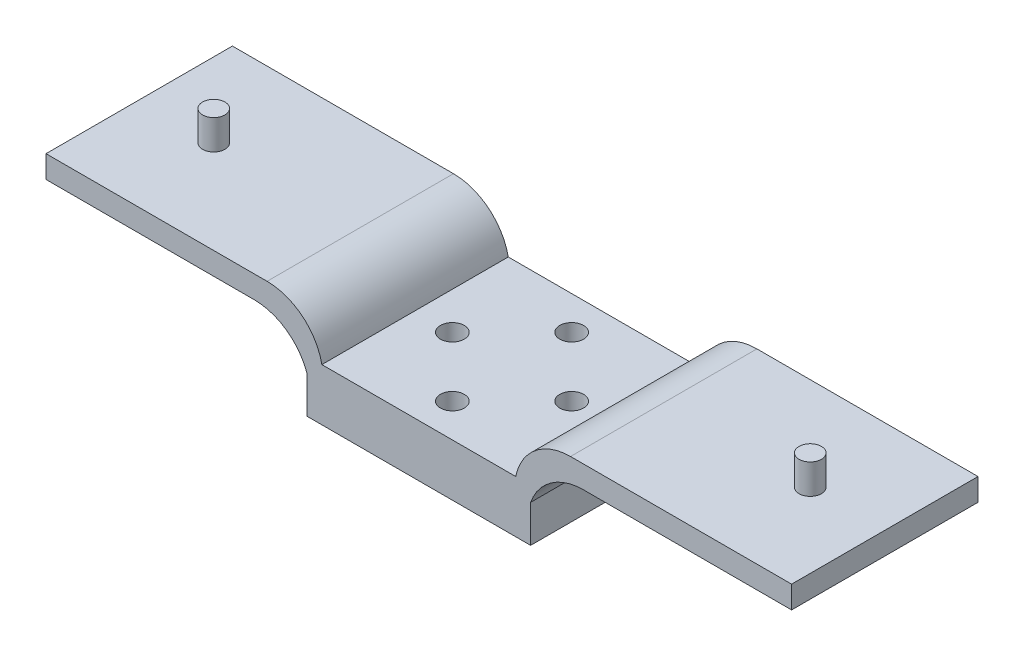
ISO-10303-21;
HEADER;
FILE_DESCRIPTION(('STEP AP214'),'2;1');
FILE_NAME('part.step','',(''),(''),'','','');
FILE_SCHEMA(('AUTOMOTIVE_DESIGN { 1 0 10303 214 1 1 1 1 }'));
ENDSEC;
DATA;
#1=APPLICATION_CONTEXT('core data for automotive mechanical design processes');
#2=APPLICATION_PROTOCOL_DEFINITION('international standard','automotive_design',2000,#1);
#3=PRODUCT_CONTEXT('',#1,'mechanical');
#4=PRODUCT('Part','Part','',(#3));
#5=PRODUCT_RELATED_PRODUCT_CATEGORY('part','',(#4));
#6=PRODUCT_DEFINITION_FORMATION('','',#4);
#7=PRODUCT_DEFINITION_CONTEXT('part definition',#1,'design');
#8=PRODUCT_DEFINITION('design','',#6,#7);
#9=PRODUCT_DEFINITION_SHAPE('','',#8);
#10=(LENGTH_UNIT() NAMED_UNIT(*) SI_UNIT(.MILLI.,.METRE.));
#11=(NAMED_UNIT(*) PLANE_ANGLE_UNIT() SI_UNIT($,.RADIAN.));
#12=(NAMED_UNIT(*) SI_UNIT($,.STERADIAN.) SOLID_ANGLE_UNIT());
#13=UNCERTAINTY_MEASURE_WITH_UNIT(LENGTH_MEASURE(1.E-05),#10,'distance_accuracy_value','');
#14=(GEOMETRIC_REPRESENTATION_CONTEXT(3) GLOBAL_UNCERTAINTY_ASSIGNED_CONTEXT((#13)) GLOBAL_UNIT_ASSIGNED_CONTEXT((#10,
#11,#12)) REPRESENTATION_CONTEXT('',''));
#15=CARTESIAN_POINT('',(0.,0.,0.));
#16=DIRECTION('',(0.,0.,1.));
#17=DIRECTION('',(1.,0.,0.));
#18=AXIS2_PLACEMENT_3D('',#15,#16,#17);
#19=CARTESIAN_POINT('',(0.,3.,0.));
#20=DIRECTION('',(0.,1.,0.));
#21=DIRECTION('',(0.,0.,1.));
#22=AXIS2_PLACEMENT_3D('',#19,#20,#21);
#23=PLANE('',#22);
#24=CARTESIAN_POINT('',(-40.,3.,0.));
#25=DIRECTION('',(0.,1.,0.));
#26=DIRECTION('',(0.,0.,1.));
#27=AXIS2_PLACEMENT_3D('',#24,#25,#26);
#28=CIRCLE('',#27,1.5);
#29=CARTESIAN_POINT('',(-40.,3.,1.5));
#30=VERTEX_POINT('',#29);
#31=EDGE_CURVE('E171',#30,#30,#28,.T.);
#32=ORIENTED_EDGE('',*,*,#31,.F.);
#33=EDGE_LOOP('',(#32));
#34=FACE_BOUND('',#33,.T.);
#35=DIRECTION('',(1.,0.,0.));
#36=VECTOR('',#35,1.);
#37=CARTESIAN_POINT('',(-50.,3.,12.5));
#38=LINE('',#37,#36);
#39=CARTESIAN_POINT('',(-50.,3.,12.5));
#40=VERTEX_POINT('',#39);
#41=CARTESIAN_POINT('',(-20.3484692283495,3.,12.5));
#42=VERTEX_POINT('',#41);
#43=EDGE_CURVE('E216',#40,#42,#38,.T.);
#44=ORIENTED_EDGE('',*,*,#43,.T.);
#45=DIRECTION('',(0.,0.,-1.));
#46=VECTOR('',#45,1.);
#47=CARTESIAN_POINT('',(-20.3484692283495,3.,-12.5));
#48=LINE('',#47,#46);
#49=CARTESIAN_POINT('',(-20.3484692283495,3.,-12.5));
#50=VERTEX_POINT('',#49);
#51=EDGE_CURVE('E241',#42,#50,#48,.T.);
#52=ORIENTED_EDGE('',*,*,#51,.T.);
#53=DIRECTION('',(-1.,0.,0.));
#54=VECTOR('',#53,1.);
#55=CARTESIAN_POINT('',(-50.,3.,-12.5));
#56=LINE('',#55,#54);
#57=CARTESIAN_POINT('',(-50.,3.,-12.5));
#58=VERTEX_POINT('',#57);
#59=EDGE_CURVE('E209',#50,#58,#56,.T.);
#60=ORIENTED_EDGE('',*,*,#59,.T.);
#61=DIRECTION('',(0.,0.,1.));
#62=VECTOR('',#61,1.);
#63=CARTESIAN_POINT('',(-50.,3.,-12.5));
#64=LINE('',#63,#62);
#65=EDGE_CURVE('E213',#58,#40,#64,.T.);
#66=ORIENTED_EDGE('',*,*,#65,.T.);
#67=EDGE_LOOP('',(#44,#52,#60,#66));
#68=FACE_BOUND('',#67,.T.);
#69=ADVANCED_FACE('F34',(#34,#68),#23,.T.);
#70=CARTESIAN_POINT('',(0.,0.,0.));
#71=DIRECTION('',(0.,1.,0.));
#72=DIRECTION('',(0.,0.,1.));
#73=AXIS2_PLACEMENT_3D('',#70,#71,#72);
#74=PLANE('',#73);
#75=DIRECTION('',(1.,0.,0.));
#76=VECTOR('',#75,1.);
#77=CARTESIAN_POINT('',(-50.,0.,12.5));
#78=LINE('',#77,#76);
#79=CARTESIAN_POINT('',(22.0710678118655,0.,12.5));
#80=VERTEX_POINT('',#79);
#81=CARTESIAN_POINT('',(50.,0.,12.5));
#82=VERTEX_POINT('',#81);
#83=EDGE_CURVE('E227',#80,#82,#78,.T.);
#84=ORIENTED_EDGE('',*,*,#83,.F.);
#85=DIRECTION('',(0.,0.,1.));
#86=VECTOR('',#85,1.);
#87=CARTESIAN_POINT('',(22.0710678118655,0.,0.));
#88=LINE('',#87,#86);
#89=CARTESIAN_POINT('',(22.0710678118655,0.,-12.5));
#90=VERTEX_POINT('',#89);
#91=EDGE_CURVE('E257',#80,#90,#88,.F.);
#92=ORIENTED_EDGE('',*,*,#91,.T.);
#93=DIRECTION('',(-1.,0.,0.));
#94=VECTOR('',#93,1.);
#95=CARTESIAN_POINT('',(-50.,0.,-12.5));
#96=LINE('',#95,#94);
#97=CARTESIAN_POINT('',(50.,0.,-12.5));
#98=VERTEX_POINT('',#97);
#99=EDGE_CURVE('E223',#98,#90,#96,.T.);
#100=ORIENTED_EDGE('',*,*,#99,.F.);
#101=DIRECTION('',(0.,0.,-1.));
#102=VECTOR('',#101,1.);
#103=CARTESIAN_POINT('',(50.,0.,-12.5));
#104=LINE('',#103,#102);
#105=EDGE_CURVE('E205',#82,#98,#104,.T.);
#106=ORIENTED_EDGE('',*,*,#105,.F.);
#107=EDGE_LOOP('',(#84,#92,#100,#106));
#108=FACE_BOUND('',#107,.T.);
#109=ADVANCED_FACE('F309',(#108),#74,.F.);
#110=CARTESIAN_POINT('',(-22.0710678118655,0.,-12.5));
#111=VERTEX_POINT('',#110);
#112=CARTESIAN_POINT('',(-50.,0.,-12.5));
#113=VERTEX_POINT('',#112);
#114=EDGE_CURVE('E222',#111,#113,#96,.T.);
#115=ORIENTED_EDGE('',*,*,#114,.F.);
#116=DIRECTION('',(0.,0.,-1.));
#117=VECTOR('',#116,1.);
#118=CARTESIAN_POINT('',(-22.0710678118655,0.,0.));
#119=LINE('',#118,#117);
#120=CARTESIAN_POINT('',(-22.0710678118655,0.,12.5));
#121=VERTEX_POINT('',#120);
#122=EDGE_CURVE('E255',#111,#121,#119,.F.);
#123=ORIENTED_EDGE('',*,*,#122,.T.);
#124=CARTESIAN_POINT('',(-50.,0.,12.5));
#125=VERTEX_POINT('',#124);
#126=EDGE_CURVE('E210',#125,#121,#78,.T.);
#127=ORIENTED_EDGE('',*,*,#126,.F.);
#128=DIRECTION('',(0.,0.,1.));
#129=VECTOR('',#128,1.);
#130=CARTESIAN_POINT('',(-50.,0.,-12.5));
#131=LINE('',#130,#129);
#132=EDGE_CURVE('E225',#113,#125,#131,.T.);
#133=ORIENTED_EDGE('',*,*,#132,.F.);
#134=EDGE_LOOP('',(#115,#123,#127,#133));
#135=FACE_BOUND('',#134,.T.);
#136=ADVANCED_FACE('F316',(#135),#74,.F.);
#137=CARTESIAN_POINT('',(50.,3.,-12.5));
#138=DIRECTION('',(-1.,0.,0.));
#139=DIRECTION('',(0.,0.,1.));
#140=AXIS2_PLACEMENT_3D('',#137,#138,#139);
#141=PLANE('',#140);
#142=ORIENTED_EDGE('',*,*,#105,.T.);
#143=DIRECTION('',(0.,-1.,0.));
#144=VECTOR('',#143,1.);
#145=CARTESIAN_POINT('',(50.,3.,-12.5));
#146=LINE('',#145,#144);
#147=CARTESIAN_POINT('',(50.,3.,-12.5));
#148=VERTEX_POINT('',#147);
#149=EDGE_CURVE('E238',#148,#98,#146,.T.);
#150=ORIENTED_EDGE('',*,*,#149,.F.);
#151=DIRECTION('',(0.,0.,-1.));
#152=VECTOR('',#151,1.);
#153=CARTESIAN_POINT('',(50.,3.,-12.5));
#154=LINE('',#153,#152);
#155=CARTESIAN_POINT('',(50.,3.,12.5));
#156=VERTEX_POINT('',#155);
#157=EDGE_CURVE('E206',#156,#148,#154,.T.);
#158=ORIENTED_EDGE('',*,*,#157,.F.);
#159=DIRECTION('',(0.,-1.,0.));
#160=VECTOR('',#159,1.);
#161=CARTESIAN_POINT('',(50.,3.,12.5));
#162=LINE('',#161,#160);
#163=EDGE_CURVE('E219',#156,#82,#162,.T.);
#164=ORIENTED_EDGE('',*,*,#163,.T.);
#165=EDGE_LOOP('',(#142,#150,#158,#164));
#166=FACE_BOUND('',#165,.T.);
#167=ADVANCED_FACE('F360',(#166),#141,.F.);
#168=CARTESIAN_POINT('',(-50.,3.,-12.5));
#169=DIRECTION('',(0.,0.,1.));
#170=DIRECTION('',(1.,0.,0.));
#171=AXIS2_PLACEMENT_3D('',#168,#169,#170);
#172=PLANE('',#171);
#173=ORIENTED_EDGE('',*,*,#59,.F.);
#174=CARTESIAN_POINT('',(-20.3484692283495,-4.5,-12.5));
#175=DIRECTION('',(0.,0.,1.));
#176=DIRECTION('',(1.,0.,0.));
#177=AXIS2_PLACEMENT_3D('',#174,#175,#176);
#178=CIRCLE('',#177,7.5);
#179=CARTESIAN_POINT('',(-13.,-3.,-12.5));
#180=VERTEX_POINT('',#179);
#181=EDGE_CURVE('E248',#50,#180,#178,.F.);
#182=ORIENTED_EDGE('',*,*,#181,.T.);
#183=DIRECTION('',(-1.,0.,0.));
#184=VECTOR('',#183,1.);
#185=CARTESIAN_POINT('',(13.,-3.,-12.5));
#186=LINE('',#185,#184);
#187=CARTESIAN_POINT('',(13.,-3.,-12.5));
#188=VERTEX_POINT('',#187);
#189=EDGE_CURVE('E176',#188,#180,#186,.T.);
#190=ORIENTED_EDGE('',*,*,#189,.F.);
#191=CARTESIAN_POINT('',(20.3484692283495,-4.5,-12.5));
#192=DIRECTION('',(0.,0.,1.));
#193=DIRECTION('',(1.,0.,0.));
#194=AXIS2_PLACEMENT_3D('',#191,#192,#193);
#195=CIRCLE('',#194,7.5);
#196=CARTESIAN_POINT('',(20.3484692283495,3.,-12.5));
#197=VERTEX_POINT('',#196);
#198=EDGE_CURVE('E246',#188,#197,#195,.F.);
#199=ORIENTED_EDGE('',*,*,#198,.T.);
#200=EDGE_CURVE('E211',#148,#197,#56,.T.);
#201=ORIENTED_EDGE('',*,*,#200,.F.);
#202=ORIENTED_EDGE('',*,*,#149,.T.);
#203=ORIENTED_EDGE('',*,*,#99,.T.);
#204=CARTESIAN_POINT('',(22.0710678118655,-7.5,-12.5));
#205=DIRECTION('',(0.,0.,1.));
#206=DIRECTION('',(1.,0.,0.));
#207=AXIS2_PLACEMENT_3D('',#204,#205,#206);
#208=CIRCLE('',#207,7.5);
#209=CARTESIAN_POINT('',(15.,-5.,-12.5));
#210=VERTEX_POINT('',#209);
#211=EDGE_CURVE('E11',#90,#210,#208,.T.);
#212=ORIENTED_EDGE('',*,*,#211,.T.);
#213=DIRECTION('',(0.,1.,0.));
#214=VECTOR('',#213,1.);
#215=CARTESIAN_POINT('',(15.,-10.,-12.5));
#216=LINE('',#215,#214);
#217=CARTESIAN_POINT('',(15.,-10.,-12.5));
#218=VERTEX_POINT('',#217);
#219=EDGE_CURVE('E140',#218,#210,#216,.T.);
#220=ORIENTED_EDGE('',*,*,#219,.F.);
#221=DIRECTION('',(1.,0.,0.));
#222=VECTOR('',#221,1.);
#223=CARTESIAN_POINT('',(-15.,-10.,-12.5));
#224=LINE('',#223,#222);
#225=CARTESIAN_POINT('',(-15.,-10.,-12.5));
#226=VERTEX_POINT('',#225);
#227=EDGE_CURVE('E145',#226,#218,#224,.T.);
#228=ORIENTED_EDGE('',*,*,#227,.F.);
#229=DIRECTION('',(0.,1.,0.));
#230=VECTOR('',#229,1.);
#231=CARTESIAN_POINT('',(-15.,-10.,-12.5));
#232=LINE('',#231,#230);
#233=CARTESIAN_POINT('',(-15.,-5.,-12.5));
#234=VERTEX_POINT('',#233);
#235=EDGE_CURVE('E273',#226,#234,#232,.T.);
#236=ORIENTED_EDGE('',*,*,#235,.T.);
#237=CARTESIAN_POINT('',(-22.0710678118655,-7.5,-12.5));
#238=DIRECTION('',(0.,0.,1.));
#239=DIRECTION('',(1.,0.,0.));
#240=AXIS2_PLACEMENT_3D('',#237,#238,#239);
#241=CIRCLE('',#240,7.5);
#242=EDGE_CURVE('E259',#234,#111,#241,.T.);
#243=ORIENTED_EDGE('',*,*,#242,.T.);
#244=ORIENTED_EDGE('',*,*,#114,.T.);
#245=DIRECTION('',(0.,-1.,0.));
#246=VECTOR('',#245,1.);
#247=CARTESIAN_POINT('',(-50.,3.,-12.5));
#248=LINE('',#247,#246);
#249=EDGE_CURVE('E235',#58,#113,#248,.T.);
#250=ORIENTED_EDGE('',*,*,#249,.F.);
#251=EDGE_LOOP('',(#173,#182,#190,#199,#201,#202,#203,#212,#220,#228,#236,#243,#244,#250));
#252=FACE_BOUND('',#251,.T.);
#253=ADVANCED_FACE('F158',(#252),#172,.F.);
#254=CARTESIAN_POINT('',(-50.,3.,-12.5));
#255=DIRECTION('',(1.,0.,0.));
#256=DIRECTION('',(0.,0.,-1.));
#257=AXIS2_PLACEMENT_3D('',#254,#255,#256);
#258=PLANE('',#257);
#259=ORIENTED_EDGE('',*,*,#132,.T.);
#260=DIRECTION('',(0.,-1.,0.));
#261=VECTOR('',#260,1.);
#262=CARTESIAN_POINT('',(-50.,3.,12.5));
#263=LINE('',#262,#261);
#264=EDGE_CURVE('E232',#40,#125,#263,.T.);
#265=ORIENTED_EDGE('',*,*,#264,.F.);
#266=ORIENTED_EDGE('',*,*,#65,.F.);
#267=ORIENTED_EDGE('',*,*,#249,.T.);
#268=EDGE_LOOP('',(#259,#265,#266,#267));
#269=FACE_BOUND('',#268,.T.);
#270=ADVANCED_FACE('F332',(#269),#258,.F.);
#271=CARTESIAN_POINT('',(-50.,3.,12.5));
#272=DIRECTION('',(0.,0.,-1.));
#273=DIRECTION('',(-1.,0.,0.));
#274=AXIS2_PLACEMENT_3D('',#271,#272,#273);
#275=PLANE('',#274);
#276=DIRECTION('',(-1.,0.,0.));
#277=VECTOR('',#276,1.);
#278=CARTESIAN_POINT('',(13.,-3.,12.5));
#279=LINE('',#278,#277);
#280=CARTESIAN_POINT('',(13.,-3.,12.5));
#281=VERTEX_POINT('',#280);
#282=CARTESIAN_POINT('',(-13.,-3.,12.5));
#283=VERTEX_POINT('',#282);
#284=EDGE_CURVE('E179',#281,#283,#279,.T.);
#285=ORIENTED_EDGE('',*,*,#284,.T.);
#286=CARTESIAN_POINT('',(-20.3484692283495,-4.5,12.5));
#287=DIRECTION('',(0.,0.,-1.));
#288=DIRECTION('',(-1.,0.,0.));
#289=AXIS2_PLACEMENT_3D('',#286,#287,#288);
#290=CIRCLE('',#289,7.5);
#291=EDGE_CURVE('E252',#283,#42,#290,.F.);
#292=ORIENTED_EDGE('',*,*,#291,.T.);
#293=ORIENTED_EDGE('',*,*,#43,.F.);
#294=ORIENTED_EDGE('',*,*,#264,.T.);
#295=ORIENTED_EDGE('',*,*,#126,.T.);
#296=CARTESIAN_POINT('',(-22.0710678118655,-7.5,12.5));
#297=DIRECTION('',(0.,0.,-1.));
#298=DIRECTION('',(-1.,0.,0.));
#299=AXIS2_PLACEMENT_3D('',#296,#297,#298);
#300=CIRCLE('',#299,7.5);
#301=CARTESIAN_POINT('',(-15.,-5.,12.5));
#302=VERTEX_POINT('',#301);
#303=EDGE_CURVE('E261',#121,#302,#300,.T.);
#304=ORIENTED_EDGE('',*,*,#303,.T.);
#305=DIRECTION('',(0.,1.,0.));
#306=VECTOR('',#305,1.);
#307=CARTESIAN_POINT('',(-15.,-10.,12.5));
#308=LINE('',#307,#306);
#309=CARTESIAN_POINT('',(-15.,-10.,12.5));
#310=VERTEX_POINT('',#309);
#311=EDGE_CURVE('E166',#310,#302,#308,.T.);
#312=ORIENTED_EDGE('',*,*,#311,.F.);
#313=DIRECTION('',(-1.,0.,0.));
#314=VECTOR('',#313,1.);
#315=CARTESIAN_POINT('',(15.,-10.,12.5));
#316=LINE('',#315,#314);
#317=CARTESIAN_POINT('',(15.,-10.,12.5));
#318=VERTEX_POINT('',#317);
#319=EDGE_CURVE('E144',#318,#310,#316,.T.);
#320=ORIENTED_EDGE('',*,*,#319,.F.);
#321=DIRECTION('',(0.,1.,0.));
#322=VECTOR('',#321,1.);
#323=CARTESIAN_POINT('',(15.,-10.,12.5));
#324=LINE('',#323,#322);
#325=CARTESIAN_POINT('',(15.,-5.,12.5));
#326=VERTEX_POINT('',#325);
#327=EDGE_CURVE('E141',#318,#326,#324,.T.);
#328=ORIENTED_EDGE('',*,*,#327,.T.);
#329=CARTESIAN_POINT('',(22.0710678118655,-7.5,12.5));
#330=DIRECTION('',(0.,0.,-1.));
#331=DIRECTION('',(-1.,0.,0.));
#332=AXIS2_PLACEMENT_3D('',#329,#330,#331);
#333=CIRCLE('',#332,7.5);
#334=EDGE_CURVE('E42',#326,#80,#333,.T.);
#335=ORIENTED_EDGE('',*,*,#334,.T.);
#336=ORIENTED_EDGE('',*,*,#83,.T.);
#337=ORIENTED_EDGE('',*,*,#163,.F.);
#338=CARTESIAN_POINT('',(20.3484692283495,3.,12.5));
#339=VERTEX_POINT('',#338);
#340=EDGE_CURVE('E215',#339,#156,#38,.T.);
#341=ORIENTED_EDGE('',*,*,#340,.F.);
#342=CARTESIAN_POINT('',(20.3484692283495,-4.5,12.5));
#343=DIRECTION('',(0.,0.,-1.));
#344=DIRECTION('',(-1.,0.,0.));
#345=AXIS2_PLACEMENT_3D('',#342,#343,#344);
#346=CIRCLE('',#345,7.5);
#347=EDGE_CURVE('E250',#339,#281,#346,.F.);
#348=ORIENTED_EDGE('',*,*,#347,.T.);
#349=EDGE_LOOP('',(#285,#292,#293,#294,#295,#304,#312,#320,#328,#335,#336,#337,#341,#348));
#350=FACE_BOUND('',#349,.T.);
#351=ADVANCED_FACE('F265',(#350),#275,.F.);
#352=CARTESIAN_POINT('',(40.,3.,0.));
#353=DIRECTION('',(0.,1.,0.));
#354=DIRECTION('',(0.,0.,1.));
#355=AXIS2_PLACEMENT_3D('',#352,#353,#354);
#356=CIRCLE('',#355,1.5);
#357=CARTESIAN_POINT('',(40.,3.,1.49999999999999));
#358=VERTEX_POINT('',#357);
#359=EDGE_CURVE('E161',#358,#358,#356,.T.);
#360=ORIENTED_EDGE('',*,*,#359,.F.);
#361=EDGE_LOOP('',(#360));
#362=FACE_BOUND('',#361,.T.);
#363=ORIENTED_EDGE('',*,*,#200,.T.);
#364=DIRECTION('',(0.,0.,1.));
#365=VECTOR('',#364,1.);
#366=CARTESIAN_POINT('',(20.3484692283495,3.,12.5));
#367=LINE('',#366,#365);
#368=EDGE_CURVE('E49',#197,#339,#367,.T.);
#369=ORIENTED_EDGE('',*,*,#368,.T.);
#370=ORIENTED_EDGE('',*,*,#340,.T.);
#371=ORIENTED_EDGE('',*,*,#157,.T.);
#372=EDGE_LOOP('',(#363,#369,#370,#371));
#373=FACE_BOUND('',#372,.T.);
#374=ADVANCED_FACE('F312',(#362,#373),#23,.T.);
#375=CARTESIAN_POINT('',(0.,3.,8.));
#376=DIRECTION('',(0.,-1.,0.));
#377=DIRECTION('',(0.,0.,-1.));
#378=AXIS2_PLACEMENT_3D('',#375,#376,#377);
#379=CYLINDRICAL_SURFACE('',#378,1.6);
#380=CARTESIAN_POINT('',(0.,-3.,8.));
#381=DIRECTION('',(0.,-1.,0.));
#382=DIRECTION('',(0.,0.,-1.));
#383=AXIS2_PLACEMENT_3D('',#380,#381,#382);
#384=CIRCLE('',#383,1.6);
#385=CARTESIAN_POINT('',(0.,-3.,6.4));
#386=VERTEX_POINT('',#385);
#387=EDGE_CURVE('E197',#386,#386,#384,.F.);
#388=ORIENTED_EDGE('',*,*,#387,.T.);
#389=EDGE_LOOP('',(#388));
#390=FACE_BOUND('',#389,.T.);
#391=CARTESIAN_POINT('',(0.,-10.,8.));
#392=DIRECTION('',(0.,-1.,0.));
#393=DIRECTION('',(0.,0.,-1.));
#394=AXIS2_PLACEMENT_3D('',#391,#392,#393);
#395=CIRCLE('',#394,1.6);
#396=CARTESIAN_POINT('',(0.,-10.,6.4));
#397=VERTEX_POINT('',#396);
#398=EDGE_CURVE('E286',#397,#397,#395,.T.);
#399=ORIENTED_EDGE('',*,*,#398,.T.);
#400=EDGE_LOOP('',(#399));
#401=FACE_BOUND('',#400,.T.);
#402=ADVANCED_FACE('F290',(#390,#401),#379,.F.);
#403=CARTESIAN_POINT('',(-8.,3.,0.));
#404=DIRECTION('',(0.,-1.,0.));
#405=DIRECTION('',(0.,0.,-1.));
#406=AXIS2_PLACEMENT_3D('',#403,#404,#405);
#407=CYLINDRICAL_SURFACE('',#406,1.6);
#408=CARTESIAN_POINT('',(-8.,-3.,0.));
#409=DIRECTION('',(0.,-1.,0.));
#410=DIRECTION('',(0.,0.,-1.));
#411=AXIS2_PLACEMENT_3D('',#408,#409,#410);
#412=CIRCLE('',#411,1.6);
#413=CARTESIAN_POINT('',(-8.,-3.,-1.59999999999995));
#414=VERTEX_POINT('',#413);
#415=EDGE_CURVE('E194',#414,#414,#412,.F.);
#416=ORIENTED_EDGE('',*,*,#415,.T.);
#417=EDGE_LOOP('',(#416));
#418=FACE_BOUND('',#417,.T.);
#419=CARTESIAN_POINT('',(-8.,-10.,0.));
#420=DIRECTION('',(0.,-1.,0.));
#421=DIRECTION('',(0.,0.,-1.));
#422=AXIS2_PLACEMENT_3D('',#419,#420,#421);
#423=CIRCLE('',#422,1.6);
#424=CARTESIAN_POINT('',(-8.,-10.,-1.59999999999995));
#425=VERTEX_POINT('',#424);
#426=EDGE_CURVE('E280',#425,#425,#423,.T.);
#427=ORIENTED_EDGE('',*,*,#426,.T.);
#428=EDGE_LOOP('',(#427));
#429=FACE_BOUND('',#428,.T.);
#430=ADVANCED_FACE('F329',(#418,#429),#407,.F.);
#431=CARTESIAN_POINT('',(0.,3.,-8.));
#432=DIRECTION('',(0.,-1.,0.));
#433=DIRECTION('',(0.,0.,-1.));
#434=AXIS2_PLACEMENT_3D('',#431,#432,#433);
#435=CYLINDRICAL_SURFACE('',#434,1.6);
#436=CARTESIAN_POINT('',(0.,-3.,-8.));
#437=DIRECTION('',(0.,-1.,0.));
#438=DIRECTION('',(0.,0.,-1.));
#439=AXIS2_PLACEMENT_3D('',#436,#437,#438);
#440=CIRCLE('',#439,1.6);
#441=CARTESIAN_POINT('',(0.,-3.,-9.6));
#442=VERTEX_POINT('',#441);
#443=EDGE_CURVE('E191',#442,#442,#440,.F.);
#444=ORIENTED_EDGE('',*,*,#443,.T.);
#445=EDGE_LOOP('',(#444));
#446=FACE_BOUND('',#445,.T.);
#447=CARTESIAN_POINT('',(0.,-10.,-8.));
#448=DIRECTION('',(0.,-1.,0.));
#449=DIRECTION('',(0.,0.,-1.));
#450=AXIS2_PLACEMENT_3D('',#447,#448,#449);
#451=CIRCLE('',#450,1.6);
#452=CARTESIAN_POINT('',(0.,-10.,-9.6));
#453=VERTEX_POINT('',#452);
#454=EDGE_CURVE('E155',#453,#453,#451,.T.);
#455=ORIENTED_EDGE('',*,*,#454,.T.);
#456=EDGE_LOOP('',(#455));
#457=FACE_BOUND('',#456,.T.);
#458=ADVANCED_FACE('F401',(#446,#457),#435,.F.);
#459=CARTESIAN_POINT('',(8.,3.,0.));
#460=DIRECTION('',(0.,-1.,0.));
#461=DIRECTION('',(0.,0.,-1.));
#462=AXIS2_PLACEMENT_3D('',#459,#460,#461);
#463=CYLINDRICAL_SURFACE('',#462,1.6);
#464=CARTESIAN_POINT('',(8.,-3.,0.));
#465=DIRECTION('',(0.,-1.,0.));
#466=DIRECTION('',(0.,0.,-1.));
#467=AXIS2_PLACEMENT_3D('',#464,#465,#466);
#468=CIRCLE('',#467,1.6);
#469=CARTESIAN_POINT('',(8.,-3.,-1.6));
#470=VERTEX_POINT('',#469);
#471=EDGE_CURVE('E188',#470,#470,#468,.F.);
#472=ORIENTED_EDGE('',*,*,#471,.T.);
#473=EDGE_LOOP('',(#472));
#474=FACE_BOUND('',#473,.T.);
#475=CARTESIAN_POINT('',(8.,-10.,0.));
#476=DIRECTION('',(0.,-1.,0.));
#477=DIRECTION('',(0.,0.,-1.));
#478=AXIS2_PLACEMENT_3D('',#475,#476,#477);
#479=CIRCLE('',#478,1.6);
#480=CARTESIAN_POINT('',(8.,-10.,-1.6));
#481=VERTEX_POINT('',#480);
#482=EDGE_CURVE('E283',#481,#481,#479,.T.);
#483=ORIENTED_EDGE('',*,*,#482,.T.);
#484=EDGE_LOOP('',(#483));
#485=FACE_BOUND('',#484,.T.);
#486=ADVANCED_FACE('F398',(#474,#485),#463,.F.);
#487=CARTESIAN_POINT('',(13.,-3.,12.5));
#488=DIRECTION('',(0.,-1.,0.));
#489=DIRECTION('',(0.,0.,-1.));
#490=AXIS2_PLACEMENT_3D('',#487,#488,#489);
#491=PLANE('',#490);
#492=ORIENTED_EDGE('',*,*,#415,.F.);
#493=EDGE_LOOP('',(#492));
#494=FACE_BOUND('',#493,.T.);
#495=ORIENTED_EDGE('',*,*,#471,.F.);
#496=EDGE_LOOP('',(#495));
#497=FACE_BOUND('',#496,.T.);
#498=ORIENTED_EDGE('',*,*,#189,.T.);
#499=DIRECTION('',(0.,0.,-1.));
#500=VECTOR('',#499,1.);
#501=CARTESIAN_POINT('',(-13.,-3.,12.5));
#502=LINE('',#501,#500);
#503=EDGE_CURVE('E185',#283,#180,#502,.T.);
#504=ORIENTED_EDGE('',*,*,#503,.F.);
#505=ORIENTED_EDGE('',*,*,#284,.F.);
#506=DIRECTION('',(0.,0.,-1.));
#507=VECTOR('',#506,1.);
#508=CARTESIAN_POINT('',(13.,-3.,12.5));
#509=LINE('',#508,#507);
#510=EDGE_CURVE('E182',#281,#188,#509,.T.);
#511=ORIENTED_EDGE('',*,*,#510,.T.);
#512=EDGE_LOOP('',(#498,#504,#505,#511));
#513=FACE_BOUND('',#512,.T.);
#514=ORIENTED_EDGE('',*,*,#443,.F.);
#515=EDGE_LOOP('',(#514));
#516=FACE_BOUND('',#515,.T.);
#517=ORIENTED_EDGE('',*,*,#387,.F.);
#518=EDGE_LOOP('',(#517));
#519=FACE_BOUND('',#518,.T.);
#520=ADVANCED_FACE('F345',(#494,#497,#513,#516,#519),#491,.F.);
#521=CARTESIAN_POINT('',(-20.3484692283495,-4.5,12.5));
#522=DIRECTION('',(0.,0.,1.));
#523=DIRECTION('',(1.,0.,0.));
#524=AXIS2_PLACEMENT_3D('',#521,#522,#523);
#525=CYLINDRICAL_SURFACE('',#524,7.5);
#526=ORIENTED_EDGE('',*,*,#291,.F.);
#527=ORIENTED_EDGE('',*,*,#503,.T.);
#528=ORIENTED_EDGE('',*,*,#181,.F.);
#529=ORIENTED_EDGE('',*,*,#51,.F.);
#530=EDGE_LOOP('',(#526,#527,#528,#529));
#531=FACE_BOUND('',#530,.T.);
#532=ADVANCED_FACE('F349',(#531),#525,.T.);
#533=CARTESIAN_POINT('',(20.3484692283495,-4.5,12.5));
#534=DIRECTION('',(0.,0.,-1.));
#535=DIRECTION('',(-1.,0.,0.));
#536=AXIS2_PLACEMENT_3D('',#533,#534,#535);
#537=CYLINDRICAL_SURFACE('',#536,7.5);
#538=ORIENTED_EDGE('',*,*,#347,.F.);
#539=ORIENTED_EDGE('',*,*,#368,.F.);
#540=ORIENTED_EDGE('',*,*,#198,.F.);
#541=ORIENTED_EDGE('',*,*,#510,.F.);
#542=EDGE_LOOP('',(#538,#539,#540,#541));
#543=FACE_BOUND('',#542,.T.);
#544=ADVANCED_FACE('F339',(#543),#537,.T.);
#545=CARTESIAN_POINT('',(-22.0710678118655,-7.5,12.5));
#546=DIRECTION('',(0.,0.,-1.));
#547=DIRECTION('',(-1.,0.,0.));
#548=AXIS2_PLACEMENT_3D('',#545,#546,#547);
#549=CYLINDRICAL_SURFACE('',#548,7.5);
#550=ORIENTED_EDGE('',*,*,#303,.F.);
#551=ORIENTED_EDGE('',*,*,#122,.F.);
#552=ORIENTED_EDGE('',*,*,#242,.F.);
#553=DIRECTION('',(0.,0.,-1.));
#554=VECTOR('',#553,1.);
#555=CARTESIAN_POINT('',(-15.,-5.,12.5));
#556=LINE('',#555,#554);
#557=EDGE_CURVE('E202',#302,#234,#556,.T.);
#558=ORIENTED_EDGE('',*,*,#557,.F.);
#559=EDGE_LOOP('',(#550,#551,#552,#558));
#560=FACE_BOUND('',#559,.T.);
#561=ADVANCED_FACE('F270',(#560),#549,.F.);
#562=CARTESIAN_POINT('',(22.0710678118655,-7.5,12.5));
#563=DIRECTION('',(0.,0.,1.));
#564=DIRECTION('',(1.,0.,0.));
#565=AXIS2_PLACEMENT_3D('',#562,#563,#564);
#566=CYLINDRICAL_SURFACE('',#565,7.5);
#567=ORIENTED_EDGE('',*,*,#211,.F.);
#568=ORIENTED_EDGE('',*,*,#91,.F.);
#569=ORIENTED_EDGE('',*,*,#334,.F.);
#570=DIRECTION('',(0.,0.,1.));
#571=VECTOR('',#570,1.);
#572=CARTESIAN_POINT('',(15.,-5.,12.5));
#573=LINE('',#572,#571);
#574=EDGE_CURVE('E200',#210,#326,#573,.T.);
#575=ORIENTED_EDGE('',*,*,#574,.F.);
#576=EDGE_LOOP('',(#567,#568,#569,#575));
#577=FACE_BOUND('',#576,.T.);
#578=ADVANCED_FACE('F36',(#577),#566,.F.);
#579=CARTESIAN_POINT('',(-40.,7.,0.));
#580=DIRECTION('',(0.,-1.,0.));
#581=DIRECTION('',(0.,0.,-1.));
#582=AXIS2_PLACEMENT_3D('',#579,#580,#581);
#583=CYLINDRICAL_SURFACE('',#582,1.5);
#584=CARTESIAN_POINT('',(-40.,7.,0.));
#585=DIRECTION('',(0.,1.,0.));
#586=DIRECTION('',(0.,0.,1.));
#587=AXIS2_PLACEMENT_3D('',#584,#585,#586);
#588=CIRCLE('',#587,1.5);
#589=CARTESIAN_POINT('',(-40.,7.,1.5));
#590=VERTEX_POINT('',#589);
#591=EDGE_CURVE('E173',#590,#590,#588,.T.);
#592=ORIENTED_EDGE('',*,*,#591,.F.);
#593=EDGE_LOOP('',(#592));
#594=FACE_BOUND('',#593,.T.);
#595=ORIENTED_EDGE('',*,*,#31,.T.);
#596=EDGE_LOOP('',(#595));
#597=FACE_BOUND('',#596,.T.);
#598=ADVANCED_FACE('F378',(#594,#597),#583,.T.);
#599=CARTESIAN_POINT('',(-40.,7.,0.));
#600=DIRECTION('',(0.,1.,0.));
#601=DIRECTION('',(0.,0.,1.));
#602=AXIS2_PLACEMENT_3D('',#599,#600,#601);
#603=PLANE('',#602);
#604=ORIENTED_EDGE('',*,*,#591,.T.);
#605=EDGE_LOOP('',(#604));
#606=FACE_BOUND('',#605,.T.);
#607=ADVANCED_FACE('F383',(#606),#603,.T.);
#608=CARTESIAN_POINT('',(40.,7.,0.));
#609=DIRECTION('',(0.,-1.,0.));
#610=DIRECTION('',(0.,0.,-1.));
#611=AXIS2_PLACEMENT_3D('',#608,#609,#610);
#612=CYLINDRICAL_SURFACE('',#611,1.5);
#613=CARTESIAN_POINT('',(40.,7.,0.));
#614=DIRECTION('',(0.,1.,0.));
#615=DIRECTION('',(0.,0.,1.));
#616=AXIS2_PLACEMENT_3D('',#613,#614,#615);
#617=CIRCLE('',#616,1.5);
#618=CARTESIAN_POINT('',(40.,7.,1.49999999999999));
#619=VERTEX_POINT('',#618);
#620=EDGE_CURVE('E164',#619,#619,#617,.T.);
#621=ORIENTED_EDGE('',*,*,#620,.F.);
#622=EDGE_LOOP('',(#621));
#623=FACE_BOUND('',#622,.T.);
#624=ORIENTED_EDGE('',*,*,#359,.T.);
#625=EDGE_LOOP('',(#624));
#626=FACE_BOUND('',#625,.T.);
#627=ADVANCED_FACE('F302',(#623,#626),#612,.T.);
#628=CARTESIAN_POINT('',(40.,7.,0.));
#629=DIRECTION('',(0.,1.,0.));
#630=DIRECTION('',(0.,0.,1.));
#631=AXIS2_PLACEMENT_3D('',#628,#629,#630);
#632=PLANE('',#631);
#633=ORIENTED_EDGE('',*,*,#620,.T.);
#634=EDGE_LOOP('',(#633));
#635=FACE_BOUND('',#634,.T.);
#636=ADVANCED_FACE('F293',(#635),#632,.T.);
#637=CARTESIAN_POINT('',(0.,-10.,0.));
#638=DIRECTION('',(0.,-1.,0.));
#639=DIRECTION('',(0.,0.,-1.));
#640=AXIS2_PLACEMENT_3D('',#637,#638,#639);
#641=PLANE('',#640);
#642=ORIENTED_EDGE('',*,*,#482,.F.);
#643=EDGE_LOOP('',(#642));
#644=FACE_BOUND('',#643,.T.);
#645=ORIENTED_EDGE('',*,*,#454,.F.);
#646=EDGE_LOOP('',(#645));
#647=FACE_BOUND('',#646,.T.);
#648=ORIENTED_EDGE('',*,*,#227,.T.);
#649=DIRECTION('',(0.,0.,1.));
#650=VECTOR('',#649,1.);
#651=CARTESIAN_POINT('',(15.,-10.,-12.5));
#652=LINE('',#651,#650);
#653=EDGE_CURVE('E135',#218,#318,#652,.T.);
#654=ORIENTED_EDGE('',*,*,#653,.T.);
#655=ORIENTED_EDGE('',*,*,#319,.T.);
#656=DIRECTION('',(0.,0.,-1.));
#657=VECTOR('',#656,1.);
#658=CARTESIAN_POINT('',(-15.,-10.,12.5));
#659=LINE('',#658,#657);
#660=EDGE_CURVE('E151',#310,#226,#659,.T.);
#661=ORIENTED_EDGE('',*,*,#660,.T.);
#662=EDGE_LOOP('',(#648,#654,#655,#661));
#663=FACE_BOUND('',#662,.T.);
#664=ORIENTED_EDGE('',*,*,#426,.F.);
#665=EDGE_LOOP('',(#664));
#666=FACE_BOUND('',#665,.T.);
#667=ORIENTED_EDGE('',*,*,#398,.F.);
#668=EDGE_LOOP('',(#667));
#669=FACE_BOUND('',#668,.T.);
#670=ADVANCED_FACE('F148',(#644,#647,#663,#666,#669),#641,.T.);
#671=CARTESIAN_POINT('',(15.,-10.,-12.5));
#672=DIRECTION('',(-1.,0.,0.));
#673=DIRECTION('',(0.,0.,1.));
#674=AXIS2_PLACEMENT_3D('',#671,#672,#673);
#675=PLANE('',#674);
#676=ORIENTED_EDGE('',*,*,#574,.T.);
#677=ORIENTED_EDGE('',*,*,#327,.F.);
#678=ORIENTED_EDGE('',*,*,#653,.F.);
#679=ORIENTED_EDGE('',*,*,#219,.T.);
#680=EDGE_LOOP('',(#676,#677,#678,#679));
#681=FACE_BOUND('',#680,.T.);
#682=ADVANCED_FACE('F138',(#681),#675,.F.);
#683=CARTESIAN_POINT('',(-15.,-10.,12.5));
#684=DIRECTION('',(1.,0.,0.));
#685=DIRECTION('',(0.,0.,-1.));
#686=AXIS2_PLACEMENT_3D('',#683,#684,#685);
#687=PLANE('',#686);
#688=ORIENTED_EDGE('',*,*,#557,.T.);
#689=ORIENTED_EDGE('',*,*,#235,.F.);
#690=ORIENTED_EDGE('',*,*,#660,.F.);
#691=ORIENTED_EDGE('',*,*,#311,.T.);
#692=EDGE_LOOP('',(#688,#689,#690,#691));
#693=FACE_BOUND('',#692,.T.);
#694=ADVANCED_FACE('F272',(#693),#687,.F.);
#695=CLOSED_SHELL('',(#69,#109,#136,#167,#253,#270,#351,#374,#402,#430,#458,#486,#520,#532,#544,
#561,#578,#598,#607,#627,#636,#670,#682,#694));
#696=MANIFOLD_SOLID_BREP('B2',#695);
#697=ADVANCED_BREP_SHAPE_REPRESENTATION('',(#18,#696),#14);
#698=SHAPE_DEFINITION_REPRESENTATION(#9,#697);
ENDSEC;
END-ISO-10303-21;
